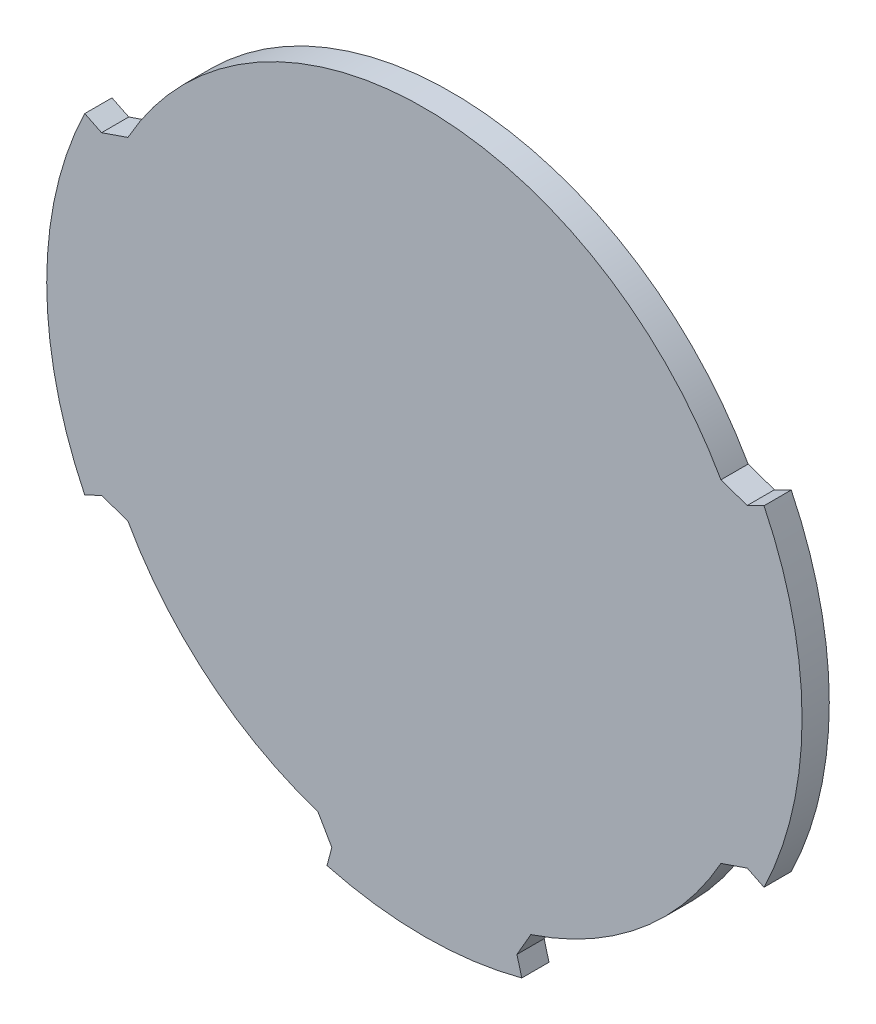
ISO-10303-21;
HEADER;
FILE_DESCRIPTION(('STEP AP214'),'2;1');
FILE_NAME('part.step','',(''),(''),'','','');
FILE_SCHEMA(('AUTOMOTIVE_DESIGN { 1 0 10303 214 1 1 1 1 }'));
ENDSEC;
DATA;
#1=APPLICATION_CONTEXT('core data for automotive mechanical design processes');
#2=APPLICATION_PROTOCOL_DEFINITION('international standard','automotive_design',2000,#1);
#3=PRODUCT_CONTEXT('',#1,'mechanical');
#4=PRODUCT('Part','Part','',(#3));
#5=PRODUCT_RELATED_PRODUCT_CATEGORY('part','',(#4));
#6=PRODUCT_DEFINITION_FORMATION('','',#4);
#7=PRODUCT_DEFINITION_CONTEXT('part definition',#1,'design');
#8=PRODUCT_DEFINITION('design','',#6,#7);
#9=PRODUCT_DEFINITION_SHAPE('','',#8);
#10=(LENGTH_UNIT() NAMED_UNIT(*) SI_UNIT(.MILLI.,.METRE.));
#11=(NAMED_UNIT(*) PLANE_ANGLE_UNIT() SI_UNIT($,.RADIAN.));
#12=(NAMED_UNIT(*) SI_UNIT($,.STERADIAN.) SOLID_ANGLE_UNIT());
#13=UNCERTAINTY_MEASURE_WITH_UNIT(LENGTH_MEASURE(1.E-05),#10,'distance_accuracy_value','');
#14=(GEOMETRIC_REPRESENTATION_CONTEXT(3) GLOBAL_UNCERTAINTY_ASSIGNED_CONTEXT((#13)) GLOBAL_UNIT_ASSIGNED_CONTEXT((#10,
#11,#12)) REPRESENTATION_CONTEXT('',''));
#15=CARTESIAN_POINT('',(0.,0.,0.));
#16=DIRECTION('',(0.,0.,1.));
#17=DIRECTION('',(1.,0.,0.));
#18=AXIS2_PLACEMENT_3D('',#15,#16,#17);
#19=CARTESIAN_POINT('',(-39.507493246488,-82.6685956195219,3.6));
#20=DIRECTION('',(0.866025403784447,-0.499999999999986,0.));
#21=DIRECTION('',(0.499999999999986,0.866025403784447,0.));
#22=AXIS2_PLACEMENT_3D('',#19,#20,#21);
#23=PLANE('',#22);
#24=DIRECTION('',(-0.499999999999986,-0.866025403784447,0.));
#25=VECTOR('',#24,1.);
#26=CARTESIAN_POINT('',(-39.507493246488,-82.6685956195219,0.));
#27=LINE('',#26,#25);
#28=CARTESIAN_POINT('',(-6.82736811946059,-26.0649585017999,0.));
#29=VERTEX_POINT('',#28);
#30=CARTESIAN_POINT('',(-8.66735025825377,-29.251901051209,0.));
#31=VERTEX_POINT('',#30);
#32=EDGE_CURVE('E188',#29,#31,#27,.T.);
#33=ORIENTED_EDGE('',*,*,#32,.F.);
#34=DIRECTION('',(0.,0.,-1.));
#35=VECTOR('',#34,1.);
#36=CARTESIAN_POINT('',(-6.82736811946059,-26.0649585017999,3.6));
#37=LINE('',#36,#35);
#38=CARTESIAN_POINT('',(-6.82736811946059,-26.0649585017999,3.6));
#39=VERTEX_POINT('',#38);
#40=EDGE_CURVE('E11',#39,#29,#37,.T.);
#41=ORIENTED_EDGE('',*,*,#40,.F.);
#42=DIRECTION('',(-0.499999999999986,-0.866025403784447,0.));
#43=VECTOR('',#42,1.);
#44=CARTESIAN_POINT('',(-39.507493246488,-82.6685956195219,3.6));
#45=LINE('',#44,#43);
#46=CARTESIAN_POINT('',(-8.66735025825377,-29.251901051209,3.6));
#47=VERTEX_POINT('',#46);
#48=EDGE_CURVE('E234',#39,#47,#45,.T.);
#49=ORIENTED_EDGE('',*,*,#48,.T.);
#50=DIRECTION('',(0.,0.,-1.));
#51=VECTOR('',#50,1.);
#52=CARTESIAN_POINT('',(-8.66735025825377,-29.251901051209,3.6));
#53=LINE('',#52,#51);
#54=EDGE_CURVE('E49',#47,#31,#53,.T.);
#55=ORIENTED_EDGE('',*,*,#54,.T.);
#56=EDGE_LOOP('',(#33,#41,#49,#55));
#57=FACE_BOUND('',#56,.T.);
#58=ADVANCED_FACE('F33',(#57),#23,.T.);
#59=CARTESIAN_POINT('',(-20.9069332839249,16.6224241210102,3.6));
#60=DIRECTION('',(0.,0.,-1.));
#61=DIRECTION('',(-1.,0.,0.));
#62=AXIS2_PLACEMENT_3D('',#59,#60,#61);
#63=CYLINDRICAL_SURFACE('',#62,44.9493803117082);
#64=CARTESIAN_POINT('',(-20.9069332839249,16.6224241210102,0.));
#65=DIRECTION('',(0.,0.,1.));
#66=DIRECTION('',(1.,0.,0.));
#67=AXIS2_PLACEMENT_3D('',#64,#65,#66);
#68=CIRCLE('',#67,44.9493803117082);
#69=CARTESIAN_POINT('',(18.3096542044872,-5.3435963690628,0.));
#70=VERTEX_POINT('',#69);
#71=EDGE_CURVE('E190',#29,#70,#68,.T.);
#72=ORIENTED_EDGE('',*,*,#71,.T.);
#73=DIRECTION('',(0.,0.,-1.));
#74=VECTOR('',#73,1.);
#75=CARTESIAN_POINT('',(18.3096542044872,-5.3435963690628,3.6));
#76=LINE('',#75,#74);
#77=CARTESIAN_POINT('',(18.3096542044872,-5.3435963690628,3.6));
#78=VERTEX_POINT('',#77);
#79=EDGE_CURVE('E41',#78,#70,#76,.T.);
#80=ORIENTED_EDGE('',*,*,#79,.F.);
#81=CARTESIAN_POINT('',(-20.9069332839249,16.6224241210102,3.6));
#82=DIRECTION('',(0.,0.,1.));
#83=DIRECTION('',(1.,0.,0.));
#84=AXIS2_PLACEMENT_3D('',#81,#82,#83);
#85=CIRCLE('',#84,44.9493803117082);
#86=EDGE_CURVE('E281',#39,#78,#85,.T.);
#87=ORIENTED_EDGE('',*,*,#86,.F.);
#88=ORIENTED_EDGE('',*,*,#40,.T.);
#89=EDGE_LOOP('',(#72,#80,#87,#88));
#90=FACE_BOUND('',#89,.T.);
#91=ADVANCED_FACE('F270',(#90),#63,.T.);
#92=CARTESIAN_POINT('',(-43.8590035112081,-26.7499819017305,3.6));
#93=DIRECTION('',(0.32556815445716,-0.945518575599316,0.));
#94=DIRECTION('',(0.945518575599316,0.32556815445716,0.));
#95=AXIS2_PLACEMENT_3D('',#92,#93,#94);
#96=PLANE('',#95);
#97=DIRECTION('',(-0.945518575599316,-0.32556815445716,0.));
#98=VECTOR('',#97,1.);
#99=CARTESIAN_POINT('',(-43.8590035112081,-26.7499819017305,0.));
#100=LINE('',#99,#98);
#101=CARTESIAN_POINT('',(21.7891287864869,-4.14551719074077,0.));
#102=VERTEX_POINT('',#101);
#103=EDGE_CURVE('E193',#102,#70,#100,.T.);
#104=ORIENTED_EDGE('',*,*,#103,.F.);
#105=DIRECTION('',(0.,0.,-1.));
#106=VECTOR('',#105,1.);
#107=CARTESIAN_POINT('',(21.7891287864869,-4.14551719074077,3.6));
#108=LINE('',#107,#106);
#109=CARTESIAN_POINT('',(21.7891287864869,-4.14551719074077,3.6));
#110=VERTEX_POINT('',#109);
#111=EDGE_CURVE('E260',#110,#102,#108,.T.);
#112=ORIENTED_EDGE('',*,*,#111,.F.);
#113=DIRECTION('',(-0.945518575599316,-0.32556815445716,0.));
#114=VECTOR('',#113,1.);
#115=CARTESIAN_POINT('',(-43.8590035112081,-26.7499819017305,3.6));
#116=LINE('',#115,#114);
#117=EDGE_CURVE('E267',#110,#78,#116,.T.);
#118=ORIENTED_EDGE('',*,*,#117,.T.);
#119=ORIENTED_EDGE('',*,*,#79,.T.);
#120=EDGE_LOOP('',(#104,#112,#118,#119));
#121=FACE_BOUND('',#120,.T.);
#122=ADVANCED_FACE('F265',(#121),#96,.T.);
#123=CARTESIAN_POINT('',(22.4676914054137,-4.47647429337394,3.6));
#124=DIRECTION('',(-0.438371146789077,-0.898794046299167,0.));
#125=DIRECTION('',(0.898794046299167,-0.438371146789077,0.));
#126=AXIS2_PLACEMENT_3D('',#123,#124,#125);
#127=PLANE('',#126);
#128=DIRECTION('',(-0.898794046299167,0.438371146789077,0.));
#129=VECTOR('',#128,1.);
#130=CARTESIAN_POINT('',(22.4676914054137,-4.47647429337394,0.));
#131=LINE('',#130,#129);
#132=CARTESIAN_POINT('',(24.0094395137578,-5.22843508917311,0.));
#133=VERTEX_POINT('',#132);
#134=EDGE_CURVE('E198',#133,#102,#131,.T.);
#135=ORIENTED_EDGE('',*,*,#134,.F.);
#136=DIRECTION('',(0.,0.,-1.));
#137=VECTOR('',#136,1.);
#138=CARTESIAN_POINT('',(24.0094395137578,-5.22843508917311,3.6));
#139=LINE('',#138,#137);
#140=CARTESIAN_POINT('',(24.0094395137578,-5.22843508917311,3.6));
#141=VERTEX_POINT('',#140);
#142=EDGE_CURVE('E258',#141,#133,#139,.T.);
#143=ORIENTED_EDGE('',*,*,#142,.F.);
#144=DIRECTION('',(-0.898794046299167,0.438371146789077,0.));
#145=VECTOR('',#144,1.);
#146=CARTESIAN_POINT('',(22.4676914054137,-4.47647429337394,3.6));
#147=LINE('',#146,#145);
#148=EDGE_CURVE('E280',#141,#110,#147,.T.);
#149=ORIENTED_EDGE('',*,*,#148,.T.);
#150=ORIENTED_EDGE('',*,*,#111,.T.);
#151=EDGE_LOOP('',(#135,#143,#149,#150));
#152=FACE_BOUND('',#151,.T.);
#153=ADVANCED_FACE('F276',(#152),#127,.T.);
#154=CARTESIAN_POINT('',(-20.9069332839249,16.6224241210102,3.6));
#155=DIRECTION('',(0.,0.,-1.));
#156=DIRECTION('',(-1.,0.,0.));
#157=AXIS2_PLACEMENT_3D('',#154,#155,#156);
#158=CYLINDRICAL_SURFACE('',#157,49.9493803117082);
#159=CARTESIAN_POINT('',(-20.9069332839249,16.6224241210102,0.));
#160=DIRECTION('',(0.,0.,1.));
#161=DIRECTION('',(1.,0.,0.));
#162=AXIS2_PLACEMENT_3D('',#159,#160,#161);
#163=CIRCLE('',#162,49.9493803117082);
#164=CARTESIAN_POINT('',(24.009439513758,38.4732833311929,0.));
#165=VERTEX_POINT('',#164);
#166=EDGE_CURVE('E201',#133,#165,#163,.T.);
#167=ORIENTED_EDGE('',*,*,#166,.T.);
#168=DIRECTION('',(0.,0.,-1.));
#169=VECTOR('',#168,1.);
#170=CARTESIAN_POINT('',(24.009439513758,38.4732833311929,3.6));
#171=LINE('',#170,#169);
#172=CARTESIAN_POINT('',(24.009439513758,38.4732833311929,3.6));
#173=VERTEX_POINT('',#172);
#174=EDGE_CURVE('E256',#173,#165,#171,.T.);
#175=ORIENTED_EDGE('',*,*,#174,.F.);
#176=CARTESIAN_POINT('',(-20.9069332839249,16.6224241210102,3.6));
#177=DIRECTION('',(0.,0.,1.));
#178=DIRECTION('',(1.,0.,0.));
#179=AXIS2_PLACEMENT_3D('',#176,#177,#178);
#180=CIRCLE('',#179,49.9493803117082);
#181=EDGE_CURVE('E283',#141,#173,#180,.T.);
#182=ORIENTED_EDGE('',*,*,#181,.F.);
#183=ORIENTED_EDGE('',*,*,#142,.T.);
#184=EDGE_LOOP('',(#167,#175,#182,#183));
#185=FACE_BOUND('',#184,.T.);
#186=ADVANCED_FACE('F390',(#185),#158,.T.);
#187=CARTESIAN_POINT('',(-64.2371775516496,-4.56746764229747,3.6));
#188=DIRECTION('',(-0.438371146789068,0.898794046299172,0.));
#189=DIRECTION('',(-0.898794046299172,-0.438371146789068,0.));
#190=AXIS2_PLACEMENT_3D('',#187,#188,#189);
#191=PLANE('',#190);
#192=DIRECTION('',(0.898794046299172,0.438371146789068,0.));
#193=VECTOR('',#192,1.);
#194=CARTESIAN_POINT('',(-64.2371775516496,-4.56746764229747,0.));
#195=LINE('',#194,#193);
#196=CARTESIAN_POINT('',(21.7891287864873,37.3903654327607,0.));
#197=VERTEX_POINT('',#196);
#198=EDGE_CURVE('E204',#197,#165,#195,.T.);
#199=ORIENTED_EDGE('',*,*,#198,.F.);
#200=DIRECTION('',(0.,0.,-1.));
#201=VECTOR('',#200,1.);
#202=CARTESIAN_POINT('',(21.7891287864873,37.3903654327607,3.6));
#203=LINE('',#202,#201);
#204=CARTESIAN_POINT('',(21.7891287864873,37.3903654327607,3.6));
#205=VERTEX_POINT('',#204);
#206=EDGE_CURVE('E254',#205,#197,#203,.T.);
#207=ORIENTED_EDGE('',*,*,#206,.F.);
#208=DIRECTION('',(0.898794046299172,0.438371146789068,0.));
#209=VECTOR('',#208,1.);
#210=CARTESIAN_POINT('',(-64.2371775516496,-4.56746764229747,3.6));
#211=LINE('',#210,#209);
#212=EDGE_CURVE('E290',#205,#173,#211,.T.);
#213=ORIENTED_EDGE('',*,*,#212,.T.);
#214=ORIENTED_EDGE('',*,*,#174,.T.);
#215=EDGE_LOOP('',(#199,#207,#213,#214));
#216=FACE_BOUND('',#215,.T.);
#217=ADVANCED_FACE('F386',(#216),#191,.T.);
#218=CARTESIAN_POINT('',(23.8822643530955,36.6696410588187,3.6));
#219=DIRECTION('',(0.325568154457163,0.945518575599315,0.));
#220=DIRECTION('',(-0.945518575599315,0.325568154457163,0.));
#221=AXIS2_PLACEMENT_3D('',#218,#219,#220);
#222=PLANE('',#221);
#223=DIRECTION('',(0.945518575599315,-0.325568154457163,0.));
#224=VECTOR('',#223,1.);
#225=CARTESIAN_POINT('',(23.8822643530955,36.6696410588187,0.));
#226=LINE('',#225,#224);
#227=CARTESIAN_POINT('',(18.3096542044874,38.5884446110828,0.));
#228=VERTEX_POINT('',#227);
#229=EDGE_CURVE('E207',#228,#197,#226,.T.);
#230=ORIENTED_EDGE('',*,*,#229,.F.);
#231=DIRECTION('',(0.,0.,-1.));
#232=VECTOR('',#231,1.);
#233=CARTESIAN_POINT('',(18.3096542044874,38.5884446110828,3.6));
#234=LINE('',#233,#232);
#235=CARTESIAN_POINT('',(18.3096542044874,38.5884446110828,3.6));
#236=VERTEX_POINT('',#235);
#237=EDGE_CURVE('E252',#236,#228,#234,.T.);
#238=ORIENTED_EDGE('',*,*,#237,.F.);
#239=DIRECTION('',(0.945518575599315,-0.325568154457163,0.));
#240=VECTOR('',#239,1.);
#241=CARTESIAN_POINT('',(23.8822643530955,36.6696410588187,3.6));
#242=LINE('',#241,#240);
#243=EDGE_CURVE('E293',#236,#205,#242,.T.);
#244=ORIENTED_EDGE('',*,*,#243,.T.);
#245=ORIENTED_EDGE('',*,*,#206,.T.);
#246=EDGE_LOOP('',(#230,#238,#244,#245));
#247=FACE_BOUND('',#246,.T.);
#248=ADVANCED_FACE('F367',(#247),#222,.T.);
#249=CARTESIAN_POINT('',(-60.1235207723371,38.588444611083,0.));
#250=VERTEX_POINT('',#249);
#251=EDGE_CURVE('E195',#228,#250,#68,.T.);
#252=ORIENTED_EDGE('',*,*,#251,.T.);
#253=DIRECTION('',(0.,0.,-1.));
#254=VECTOR('',#253,1.);
#255=CARTESIAN_POINT('',(-60.1235207723371,38.588444611083,3.6));
#256=LINE('',#255,#254);
#257=CARTESIAN_POINT('',(-60.1235207723371,38.588444611083,3.6));
#258=VERTEX_POINT('',#257);
#259=EDGE_CURVE('E250',#258,#250,#256,.T.);
#260=ORIENTED_EDGE('',*,*,#259,.F.);
#261=EDGE_CURVE('E286',#236,#258,#85,.T.);
#262=ORIENTED_EDGE('',*,*,#261,.F.);
#263=ORIENTED_EDGE('',*,*,#237,.T.);
#264=EDGE_LOOP('',(#252,#260,#262,#263));
#265=FACE_BOUND('',#264,.T.);
#266=ADVANCED_FACE('F320',(#265),#63,.T.);
#267=CARTESIAN_POINT('',(-65.6961309209456,36.6696410588188,3.6));
#268=DIRECTION('',(-0.325568154457166,0.945518575599314,0.));
#269=DIRECTION('',(-0.945518575599314,-0.325568154457166,0.));
#270=AXIS2_PLACEMENT_3D('',#267,#268,#269);
#271=PLANE('',#270);
#272=DIRECTION('',(0.945518575599314,0.325568154457166,0.));
#273=VECTOR('',#272,1.);
#274=CARTESIAN_POINT('',(-65.6961309209456,36.6696410588188,0.));
#275=LINE('',#274,#273);
#276=CARTESIAN_POINT('',(-63.6029953543369,37.3903654327609,0.));
#277=VERTEX_POINT('',#276);
#278=EDGE_CURVE('E210',#277,#250,#275,.T.);
#279=ORIENTED_EDGE('',*,*,#278,.F.);
#280=DIRECTION('',(0.,0.,-1.));
#281=VECTOR('',#280,1.);
#282=CARTESIAN_POINT('',(-63.6029953543369,37.3903654327609,3.6));
#283=LINE('',#282,#281);
#284=CARTESIAN_POINT('',(-63.6029953543369,37.3903654327609,3.6));
#285=VERTEX_POINT('',#284);
#286=EDGE_CURVE('E248',#285,#277,#283,.T.);
#287=ORIENTED_EDGE('',*,*,#286,.F.);
#288=DIRECTION('',(0.945518575599314,0.325568154457166,0.));
#289=VECTOR('',#288,1.);
#290=CARTESIAN_POINT('',(-65.6961309209456,36.6696410588188,3.6));
#291=LINE('',#290,#289);
#292=EDGE_CURVE('E296',#285,#258,#291,.T.);
#293=ORIENTED_EDGE('',*,*,#292,.T.);
#294=ORIENTED_EDGE('',*,*,#259,.T.);
#295=EDGE_LOOP('',(#279,#287,#293,#294));
#296=FACE_BOUND('',#295,.T.);
#297=ADVANCED_FACE('F324',(#296),#271,.T.);
#298=CARTESIAN_POINT('',(22.4233109838003,-4.56746764229822,3.6));
#299=DIRECTION('',(0.438371146789075,0.898794046299168,0.));
#300=DIRECTION('',(-0.898794046299168,0.438371146789075,0.));
#301=AXIS2_PLACEMENT_3D('',#298,#299,#300);
#302=PLANE('',#301);
#303=DIRECTION('',(0.898794046299168,-0.438371146789075,0.));
#304=VECTOR('',#303,1.);
#305=CARTESIAN_POINT('',(22.4233109838003,-4.56746764229822,0.));
#306=LINE('',#305,#304);
#307=CARTESIAN_POINT('',(-65.8233060816077,38.4732833311932,0.));
#308=VERTEX_POINT('',#307);
#309=EDGE_CURVE('E213',#308,#277,#306,.T.);
#310=ORIENTED_EDGE('',*,*,#309,.F.);
#311=DIRECTION('',(0.,0.,-1.));
#312=VECTOR('',#311,1.);
#313=CARTESIAN_POINT('',(-65.8233060816077,38.4732833311932,3.6));
#314=LINE('',#313,#312);
#315=CARTESIAN_POINT('',(-65.8233060816077,38.4732833311932,3.6));
#316=VERTEX_POINT('',#315);
#317=EDGE_CURVE('E246',#316,#308,#314,.T.);
#318=ORIENTED_EDGE('',*,*,#317,.F.);
#319=DIRECTION('',(0.898794046299168,-0.438371146789075,0.));
#320=VECTOR('',#319,1.);
#321=CARTESIAN_POINT('',(22.4233109838003,-4.56746764229822,3.6));
#322=LINE('',#321,#320);
#323=EDGE_CURVE('E299',#316,#285,#322,.T.);
#324=ORIENTED_EDGE('',*,*,#323,.T.);
#325=ORIENTED_EDGE('',*,*,#286,.T.);
#326=EDGE_LOOP('',(#310,#318,#324,#325));
#327=FACE_BOUND('',#326,.T.);
#328=ADVANCED_FACE('F327',(#327),#302,.T.);
#329=CARTESIAN_POINT('',(-20.9069332839249,16.6224241210102,3.6));
#330=DIRECTION('',(0.,0.,-1.));
#331=DIRECTION('',(-1.,0.,0.));
#332=AXIS2_PLACEMENT_3D('',#329,#330,#331);
#333=CYLINDRICAL_SURFACE('',#332,49.9493803117082);
#334=CARTESIAN_POINT('',(-20.9069332839249,16.6224241210102,0.));
#335=DIRECTION('',(0.,0.,1.));
#336=DIRECTION('',(1.,0.,0.));
#337=AXIS2_PLACEMENT_3D('',#334,#335,#336);
#338=CIRCLE('',#337,49.9493803117082);
#339=CARTESIAN_POINT('',(-65.8233060816077,-5.22843508917282,0.));
#340=VERTEX_POINT('',#339);
#341=EDGE_CURVE('E216',#308,#340,#338,.T.);
#342=ORIENTED_EDGE('',*,*,#341,.T.);
#343=DIRECTION('',(0.,0.,-1.));
#344=VECTOR('',#343,1.);
#345=CARTESIAN_POINT('',(-65.8233060816077,-5.22843508917282,3.6));
#346=LINE('',#345,#344);
#347=CARTESIAN_POINT('',(-65.8233060816077,-5.22843508917282,3.6));
#348=VERTEX_POINT('',#347);
#349=EDGE_CURVE('E244',#348,#340,#346,.T.);
#350=ORIENTED_EDGE('',*,*,#349,.F.);
#351=CARTESIAN_POINT('',(-20.9069332839249,16.6224241210102,3.6));
#352=DIRECTION('',(0.,0.,1.));
#353=DIRECTION('',(1.,0.,0.));
#354=AXIS2_PLACEMENT_3D('',#351,#352,#353);
#355=CIRCLE('',#354,49.9493803117082);
#356=EDGE_CURVE('E302',#316,#348,#355,.T.);
#357=ORIENTED_EDGE('',*,*,#356,.F.);
#358=ORIENTED_EDGE('',*,*,#317,.T.);
#359=EDGE_LOOP('',(#342,#350,#357,#358));
#360=FACE_BOUND('',#359,.T.);
#361=ADVANCED_FACE('F332',(#360),#333,.T.);
#362=CARTESIAN_POINT('',(-64.2815579732631,-4.4764742933734,3.6));
#363=DIRECTION('',(0.438371146789072,-0.89879404629917,0.));
#364=DIRECTION('',(0.89879404629917,0.438371146789072,0.));
#365=AXIS2_PLACEMENT_3D('',#362,#363,#364);
#366=PLANE('',#365);
#367=DIRECTION('',(-0.89879404629917,-0.438371146789072,0.));
#368=VECTOR('',#367,1.);
#369=CARTESIAN_POINT('',(-64.2815579732631,-4.4764742933734,0.));
#370=LINE('',#369,#368);
#371=CARTESIAN_POINT('',(-63.602995354337,-4.14551719074054,0.));
#372=VERTEX_POINT('',#371);
#373=EDGE_CURVE('E219',#372,#340,#370,.T.);
#374=ORIENTED_EDGE('',*,*,#373,.F.);
#375=DIRECTION('',(0.,0.,-1.));
#376=VECTOR('',#375,1.);
#377=CARTESIAN_POINT('',(-63.602995354337,-4.14551719074054,3.6));
#378=LINE('',#377,#376);
#379=CARTESIAN_POINT('',(-63.602995354337,-4.14551719074054,3.6));
#380=VERTEX_POINT('',#379);
#381=EDGE_CURVE('E242',#380,#372,#378,.T.);
#382=ORIENTED_EDGE('',*,*,#381,.F.);
#383=DIRECTION('',(-0.89879404629917,-0.438371146789072,0.));
#384=VECTOR('',#383,1.);
#385=CARTESIAN_POINT('',(-64.2815579732631,-4.4764742933734,3.6));
#386=LINE('',#385,#384);
#387=EDGE_CURVE('E304',#380,#348,#386,.T.);
#388=ORIENTED_EDGE('',*,*,#387,.T.);
#389=ORIENTED_EDGE('',*,*,#349,.T.);
#390=EDGE_LOOP('',(#374,#382,#388,#389));
#391=FACE_BOUND('',#390,.T.);
#392=ADVANCED_FACE('F336',(#391),#366,.T.);
#393=CARTESIAN_POINT('',(2.04513694335842,-26.7499819017305,3.6));
#394=DIRECTION('',(-0.325568154457161,-0.945518575599315,0.));
#395=DIRECTION('',(0.945518575599315,-0.325568154457161,0.));
#396=AXIS2_PLACEMENT_3D('',#393,#394,#395);
#397=PLANE('',#396);
#398=DIRECTION('',(-0.945518575599315,0.325568154457161,0.));
#399=VECTOR('',#398,1.);
#400=CARTESIAN_POINT('',(2.04513694335842,-26.7499819017305,0.));
#401=LINE('',#400,#399);
#402=CARTESIAN_POINT('',(-60.123520772337,-5.34359636906264,0.));
#403=VERTEX_POINT('',#402);
#404=EDGE_CURVE('E222',#403,#372,#401,.T.);
#405=ORIENTED_EDGE('',*,*,#404,.F.);
#406=DIRECTION('',(0.,0.,-1.));
#407=VECTOR('',#406,1.);
#408=CARTESIAN_POINT('',(-60.123520772337,-5.34359636906264,3.6));
#409=LINE('',#408,#407);
#410=CARTESIAN_POINT('',(-60.123520772337,-5.34359636906264,3.6));
#411=VERTEX_POINT('',#410);
#412=EDGE_CURVE('E240',#411,#403,#409,.T.);
#413=ORIENTED_EDGE('',*,*,#412,.F.);
#414=DIRECTION('',(-0.945518575599315,0.325568154457161,0.));
#415=VECTOR('',#414,1.);
#416=CARTESIAN_POINT('',(2.04513694335842,-26.7499819017305,3.6));
#417=LINE('',#416,#415);
#418=EDGE_CURVE('E306',#411,#380,#417,.T.);
#419=ORIENTED_EDGE('',*,*,#418,.T.);
#420=ORIENTED_EDGE('',*,*,#381,.T.);
#421=EDGE_LOOP('',(#405,#413,#419,#420));
#422=FACE_BOUND('',#421,.T.);
#423=ADVANCED_FACE('F338',(#422),#397,.T.);
#424=CARTESIAN_POINT('',(-34.9864984483888,-26.0649585018,0.));
#425=VERTEX_POINT('',#424);
#426=EDGE_CURVE('E194',#403,#425,#68,.T.);
#427=ORIENTED_EDGE('',*,*,#426,.T.);
#428=DIRECTION('',(0.,0.,-1.));
#429=VECTOR('',#428,1.);
#430=CARTESIAN_POINT('',(-34.9864984483888,-26.0649585018,3.6));
#431=LINE('',#430,#429);
#432=CARTESIAN_POINT('',(-34.9864984483888,-26.0649585018,3.6));
#433=VERTEX_POINT('',#432);
#434=EDGE_CURVE('E238',#433,#425,#431,.T.);
#435=ORIENTED_EDGE('',*,*,#434,.F.);
#436=EDGE_CURVE('E183',#411,#433,#85,.T.);
#437=ORIENTED_EDGE('',*,*,#436,.F.);
#438=ORIENTED_EDGE('',*,*,#412,.T.);
#439=EDGE_LOOP('',(#427,#435,#437,#438));
#440=FACE_BOUND('',#439,.T.);
#441=ADVANCED_FACE('F343',(#440),#63,.T.);
#442=CARTESIAN_POINT('',(-2.30637332136106,-82.6685956195213,3.6));
#443=DIRECTION('',(-0.866025403784442,-0.499999999999994,0.));
#444=DIRECTION('',(0.499999999999994,-0.866025403784442,0.));
#445=AXIS2_PLACEMENT_3D('',#442,#443,#444);
#446=PLANE('',#445);
#447=DIRECTION('',(-0.499999999999994,0.866025403784442,0.));
#448=VECTOR('',#447,1.);
#449=CARTESIAN_POINT('',(-2.30637332136106,-82.6685956195213,0.));
#450=LINE('',#449,#448);
#451=CARTESIAN_POINT('',(-33.1465163095956,-29.251901051209,0.));
#452=VERTEX_POINT('',#451);
#453=EDGE_CURVE('E225',#452,#425,#450,.T.);
#454=ORIENTED_EDGE('',*,*,#453,.F.);
#455=DIRECTION('',(0.,0.,-1.));
#456=VECTOR('',#455,1.);
#457=CARTESIAN_POINT('',(-33.1465163095956,-29.251901051209,3.6));
#458=LINE('',#457,#456);
#459=CARTESIAN_POINT('',(-33.1465163095956,-29.251901051209,3.6));
#460=VERTEX_POINT('',#459);
#461=EDGE_CURVE('E169',#460,#452,#458,.T.);
#462=ORIENTED_EDGE('',*,*,#461,.F.);
#463=DIRECTION('',(-0.499999999999994,0.866025403784442,0.));
#464=VECTOR('',#463,1.);
#465=CARTESIAN_POINT('',(-2.30637332136106,-82.6685956195213,3.6));
#466=LINE('',#465,#464);
#467=EDGE_CURVE('E181',#460,#433,#466,.T.);
#468=ORIENTED_EDGE('',*,*,#467,.T.);
#469=ORIENTED_EDGE('',*,*,#434,.T.);
#470=EDGE_LOOP('',(#454,#462,#468,#469));
#471=FACE_BOUND('',#470,.T.);
#472=ADVANCED_FACE('F345',(#471),#446,.T.);
#473=CARTESIAN_POINT('',(-48.3655529301844,-86.0501189614963,3.6));
#474=DIRECTION('',(-0.965925826289067,0.258819045102526,0.));
#475=DIRECTION('',(-0.258819045102526,-0.965925826289067,0.));
#476=AXIS2_PLACEMENT_3D('',#473,#474,#475);
#477=PLANE('',#476);
#478=DIRECTION('',(0.258819045102526,0.965925826289067,0.));
#479=VECTOR('',#478,1.);
#480=CARTESIAN_POINT('',(-48.3655529301844,-86.0501189614963,0.));
#481=LINE('',#480,#479);
#482=CARTESIAN_POINT('',(-33.7858826968445,-31.6380488930736,0.));
#483=VERTEX_POINT('',#482);
#484=EDGE_CURVE('E166',#483,#452,#481,.T.);
#485=ORIENTED_EDGE('',*,*,#484,.F.);
#486=DIRECTION('',(0.,0.,-1.));
#487=VECTOR('',#486,1.);
#488=CARTESIAN_POINT('',(-33.7858826968445,-31.6380488930736,3.6));
#489=LINE('',#488,#487);
#490=CARTESIAN_POINT('',(-33.7858826968445,-31.6380488930736,3.6));
#491=VERTEX_POINT('',#490);
#492=EDGE_CURVE('E160',#491,#483,#489,.T.);
#493=ORIENTED_EDGE('',*,*,#492,.F.);
#494=DIRECTION('',(0.258819045102526,0.965925826289067,0.));
#495=VECTOR('',#494,1.);
#496=CARTESIAN_POINT('',(-48.3655529301844,-86.0501189614963,3.6));
#497=LINE('',#496,#495);
#498=EDGE_CURVE('E164',#491,#460,#497,.T.);
#499=ORIENTED_EDGE('',*,*,#498,.T.);
#500=ORIENTED_EDGE('',*,*,#461,.T.);
#501=EDGE_LOOP('',(#485,#493,#499,#500));
#502=FACE_BOUND('',#501,.T.);
#503=ADVANCED_FACE('F162',(#502),#477,.T.);
#504=CARTESIAN_POINT('',(-20.9069332839249,16.6224241210102,3.6));
#505=DIRECTION('',(0.,0.,-1.));
#506=DIRECTION('',(-1.,0.,0.));
#507=AXIS2_PLACEMENT_3D('',#504,#505,#506);
#508=CYLINDRICAL_SURFACE('',#507,49.9493803117082);
#509=CARTESIAN_POINT('',(-20.9069332839249,16.6224241210102,0.));
#510=DIRECTION('',(0.,0.,1.));
#511=DIRECTION('',(1.,0.,0.));
#512=AXIS2_PLACEMENT_3D('',#509,#510,#511);
#513=CIRCLE('',#512,49.9493803117082);
#514=CARTESIAN_POINT('',(-8.02798387100486,-31.6380488930735,0.));
#515=VERTEX_POINT('',#514);
#516=EDGE_CURVE('E229',#483,#515,#513,.T.);
#517=ORIENTED_EDGE('',*,*,#516,.T.);
#518=DIRECTION('',(0.,0.,-1.));
#519=VECTOR('',#518,1.);
#520=CARTESIAN_POINT('',(-8.02798387100486,-31.6380488930735,3.6));
#521=LINE('',#520,#519);
#522=CARTESIAN_POINT('',(-8.02798387100486,-31.6380488930735,3.6));
#523=VERTEX_POINT('',#522);
#524=EDGE_CURVE('E105',#523,#515,#521,.T.);
#525=ORIENTED_EDGE('',*,*,#524,.F.);
#526=CARTESIAN_POINT('',(-20.9069332839249,16.6224241210102,3.6));
#527=DIRECTION('',(0.,0.,1.));
#528=DIRECTION('',(1.,0.,0.));
#529=AXIS2_PLACEMENT_3D('',#526,#527,#528);
#530=CIRCLE('',#529,49.9493803117082);
#531=EDGE_CURVE('E171',#491,#523,#530,.T.);
#532=ORIENTED_EDGE('',*,*,#531,.F.);
#533=ORIENTED_EDGE('',*,*,#492,.T.);
#534=EDGE_LOOP('',(#517,#525,#532,#533));
#535=FACE_BOUND('',#534,.T.);
#536=ADVANCED_FACE('F172',(#535),#508,.T.);
#537=CARTESIAN_POINT('',(6.55168636233534,-86.0501189614959,3.6));
#538=DIRECTION('',(0.965925826289065,0.258819045102534,0.));
#539=DIRECTION('',(-0.258819045102534,0.965925826289065,0.));
#540=AXIS2_PLACEMENT_3D('',#537,#538,#539);
#541=PLANE('',#540);
#542=DIRECTION('',(0.258819045102534,-0.965925826289065,0.));
#543=VECTOR('',#542,1.);
#544=CARTESIAN_POINT('',(6.55168636233534,-86.0501189614959,0.));
#545=LINE('',#544,#543);
#546=EDGE_CURVE('E231',#31,#515,#545,.T.);
#547=ORIENTED_EDGE('',*,*,#546,.F.);
#548=ORIENTED_EDGE('',*,*,#54,.F.);
#549=DIRECTION('',(0.258819045102534,-0.965925826289065,0.));
#550=VECTOR('',#549,1.);
#551=CARTESIAN_POINT('',(6.55168636233534,-86.0501189614959,3.6));
#552=LINE('',#551,#550);
#553=EDGE_CURVE('E175',#47,#523,#552,.T.);
#554=ORIENTED_EDGE('',*,*,#553,.T.);
#555=ORIENTED_EDGE('',*,*,#524,.T.);
#556=EDGE_LOOP('',(#547,#548,#554,#555));
#557=FACE_BOUND('',#556,.T.);
#558=ADVANCED_FACE('F346',(#557),#541,.T.);
#559=CARTESIAN_POINT('',(-20.9069332839249,-93.4076339209851,3.6));
#560=DIRECTION('',(0.,0.,1.));
#561=DIRECTION('',(1.,0.,0.));
#562=AXIS2_PLACEMENT_3D('',#559,#560,#561);
#563=PLANE('',#562);
#564=ORIENTED_EDGE('',*,*,#48,.F.);
#565=ORIENTED_EDGE('',*,*,#86,.T.);
#566=ORIENTED_EDGE('',*,*,#117,.F.);
#567=ORIENTED_EDGE('',*,*,#148,.F.);
#568=ORIENTED_EDGE('',*,*,#181,.T.);
#569=ORIENTED_EDGE('',*,*,#212,.F.);
#570=ORIENTED_EDGE('',*,*,#243,.F.);
#571=ORIENTED_EDGE('',*,*,#261,.T.);
#572=ORIENTED_EDGE('',*,*,#292,.F.);
#573=ORIENTED_EDGE('',*,*,#323,.F.);
#574=ORIENTED_EDGE('',*,*,#356,.T.);
#575=ORIENTED_EDGE('',*,*,#387,.F.);
#576=ORIENTED_EDGE('',*,*,#418,.F.);
#577=ORIENTED_EDGE('',*,*,#436,.T.);
#578=ORIENTED_EDGE('',*,*,#467,.F.);
#579=ORIENTED_EDGE('',*,*,#498,.F.);
#580=ORIENTED_EDGE('',*,*,#531,.T.);
#581=ORIENTED_EDGE('',*,*,#553,.F.);
#582=EDGE_LOOP('',(#564,#565,#566,#567,#568,#569,#570,#571,#572,#573,#574,#575,#576,#577,#578,
#579,#580,#581));
#583=FACE_BOUND('',#582,.T.);
#584=ADVANCED_FACE('F179',(#583),#563,.T.);
#585=CARTESIAN_POINT('',(-20.9069332839249,-93.4076339209851,0.));
#586=DIRECTION('',(0.,0.,1.));
#587=DIRECTION('',(1.,0.,0.));
#588=AXIS2_PLACEMENT_3D('',#585,#586,#587);
#589=PLANE('',#588);
#590=ORIENTED_EDGE('',*,*,#32,.T.);
#591=ORIENTED_EDGE('',*,*,#546,.T.);
#592=ORIENTED_EDGE('',*,*,#516,.F.);
#593=ORIENTED_EDGE('',*,*,#484,.T.);
#594=ORIENTED_EDGE('',*,*,#453,.T.);
#595=ORIENTED_EDGE('',*,*,#426,.F.);
#596=ORIENTED_EDGE('',*,*,#404,.T.);
#597=ORIENTED_EDGE('',*,*,#373,.T.);
#598=ORIENTED_EDGE('',*,*,#341,.F.);
#599=ORIENTED_EDGE('',*,*,#309,.T.);
#600=ORIENTED_EDGE('',*,*,#278,.T.);
#601=ORIENTED_EDGE('',*,*,#251,.F.);
#602=ORIENTED_EDGE('',*,*,#229,.T.);
#603=ORIENTED_EDGE('',*,*,#198,.T.);
#604=ORIENTED_EDGE('',*,*,#166,.F.);
#605=ORIENTED_EDGE('',*,*,#134,.T.);
#606=ORIENTED_EDGE('',*,*,#103,.T.);
#607=ORIENTED_EDGE('',*,*,#71,.F.);
#608=EDGE_LOOP('',(#590,#591,#592,#593,#594,#595,#596,#597,#598,#599,#600,#601,#602,#603,#604,
#605,#606,#607));
#609=FACE_BOUND('',#608,.T.);
#610=ADVANCED_FACE('F272',(#609),#589,.F.);
#611=CLOSED_SHELL('',(#58,#91,#122,#153,#186,#217,#248,#266,#297,#328,#361,#392,#423,#441,#472,
#503,#536,#558,#584,#610));
#612=MANIFOLD_SOLID_BREP('B2',#611);
#613=ADVANCED_BREP_SHAPE_REPRESENTATION('',(#18,#612),#14);
#614=SHAPE_DEFINITION_REPRESENTATION(#9,#613);
ENDSEC;
END-ISO-10303-21;
